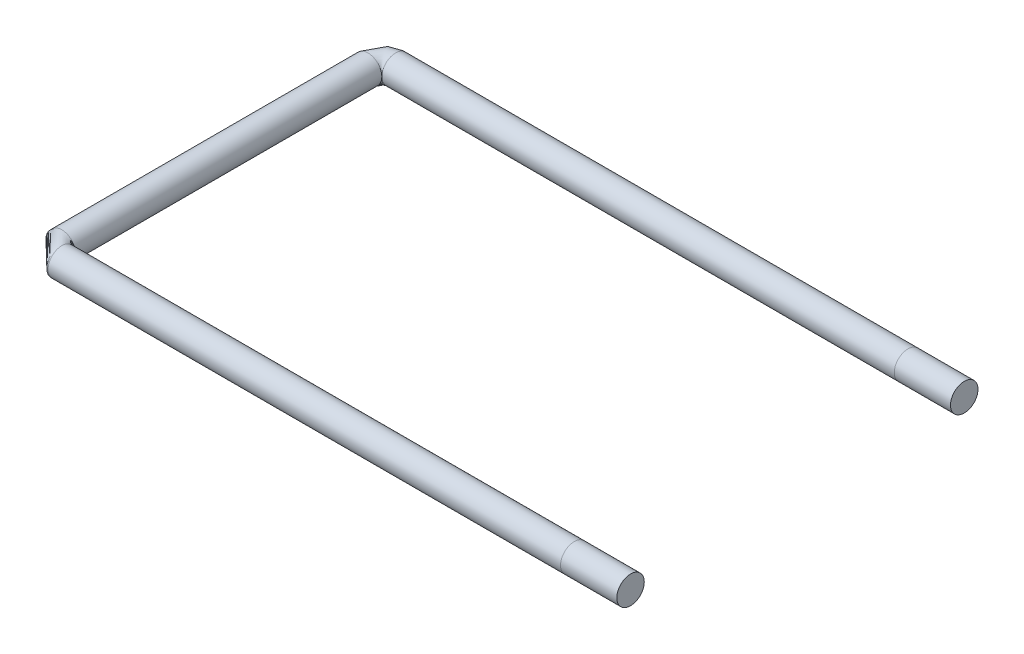
ISO-10303-21;
HEADER;
FILE_DESCRIPTION(('STEP AP214'),'2;1');
FILE_NAME('part.step','',(''),(''),'','','');
FILE_SCHEMA(('AUTOMOTIVE_DESIGN { 1 0 10303 214 1 1 1 1 }'));
ENDSEC;
DATA;
#1=APPLICATION_CONTEXT('core data for automotive mechanical design processes');
#2=APPLICATION_PROTOCOL_DEFINITION('international standard','automotive_design',2000,#1);
#3=PRODUCT_CONTEXT('',#1,'mechanical');
#4=PRODUCT('Part','Part','',(#3));
#5=PRODUCT_RELATED_PRODUCT_CATEGORY('part','',(#4));
#6=PRODUCT_DEFINITION_FORMATION('','',#4);
#7=PRODUCT_DEFINITION_CONTEXT('part definition',#1,'design');
#8=PRODUCT_DEFINITION('design','',#6,#7);
#9=PRODUCT_DEFINITION_SHAPE('','',#8);
#10=(LENGTH_UNIT() NAMED_UNIT(*) SI_UNIT(.MILLI.,.METRE.));
#11=(NAMED_UNIT(*) PLANE_ANGLE_UNIT() SI_UNIT($,.RADIAN.));
#12=(NAMED_UNIT(*) SI_UNIT($,.STERADIAN.) SOLID_ANGLE_UNIT());
#13=UNCERTAINTY_MEASURE_WITH_UNIT(LENGTH_MEASURE(1.E-05),#10,'distance_accuracy_value','');
#14=(GEOMETRIC_REPRESENTATION_CONTEXT(3) GLOBAL_UNCERTAINTY_ASSIGNED_CONTEXT((#13)) GLOBAL_UNIT_ASSIGNED_CONTEXT((#10,
#11,#12)) REPRESENTATION_CONTEXT('',''));
#15=CARTESIAN_POINT('',(0.,0.,0.));
#16=DIRECTION('',(0.,0.,1.));
#17=DIRECTION('',(1.,0.,0.));
#18=AXIS2_PLACEMENT_3D('',#15,#16,#17);
#19=CARTESIAN_POINT('',(11.,0.,0.));
#20=DIRECTION('',(0.,-1.,0.));
#21=DIRECTION('',(0.,0.,-1.));
#22=AXIS2_PLACEMENT_3D('',#19,#20,#21);
#23=TOROIDAL_SURFACE('',#22,11.,10.995);
#24=CARTESIAN_POINT('',(11.0000000000003,0.,11.));
#25=DIRECTION('',(1.,0.,0.));
#26=DIRECTION('',(0.,0.,-1.));
#27=AXIS2_PLACEMENT_3D('',#24,#25,#26);
#28=CIRCLE('',#27,11.);
#29=CARTESIAN_POINT('',(11.0000000000001,0.,0.));
#30=VERTEX_POINT('',#29);
#31=EDGE_CURVE('E11',#30,#30,#28,.T.);
#32=ORIENTED_EDGE('',*,*,#31,.F.);
#33=EDGE_LOOP('',(#32));
#34=FACE_BOUND('',#33,.T.);
#35=CARTESIAN_POINT('',(0.,0.,0.));
#36=DIRECTION('',(0.,0.,-1.));
#37=DIRECTION('',(1.,0.,0.));
#38=AXIS2_PLACEMENT_3D('',#35,#36,#37);
#39=CIRCLE('',#38,11.);
#40=CARTESIAN_POINT('',(10.9975,0.,0.));
#41=VERTEX_POINT('',#40);
#42=EDGE_CURVE('E47',#41,#41,#39,.T.);
#43=ORIENTED_EDGE('',*,*,#42,.F.);
#44=EDGE_LOOP('',(#43));
#45=FACE_BOUND('',#44,.T.);
#46=ADVANCED_FACE('F36',(#34,#45),#23,.T.);
#47=CARTESIAN_POINT('',(0.,0.,-122.5));
#48=DIRECTION('',(0.,0.,1.));
#49=DIRECTION('',(1.,0.,0.));
#50=AXIS2_PLACEMENT_3D('',#47,#48,#49);
#51=CYLINDRICAL_SURFACE('',#50,11.);
#52=ORIENTED_EDGE('',*,*,#42,.T.);
#53=EDGE_LOOP('',(#52));
#54=FACE_BOUND('',#53,.T.);
#55=CARTESIAN_POINT('',(10.995,0.,-245.));
#56=CARTESIAN_POINT('',(10.9950038162411,-0.179905448478485,-245.));
#57=CARTESIAN_POINT('',(10.9905845962911,-0.359810572232255,-245.));
#58=CARTESIAN_POINT('',(10.9729274856607,-0.719187586227661,-245.));
#59=CARTESIAN_POINT('',(10.9596895949803,-0.898659476469296,-245.));
#60=CARTESIAN_POINT('',(10.9244225445413,-1.25673743937773,-245.));
#61=CARTESIAN_POINT('',(10.9023933847825,-1.43534351204454,-245.));
#62=CARTESIAN_POINT('',(10.849598069343,-1.79125962122887,-245.));
#63=CARTESIAN_POINT('',(10.8188319136623,-1.9685696577464,-245.));
#64=CARTESIAN_POINT('',(10.7486364024048,-2.32146652338826,-245.));
#65=CARTESIAN_POINT('',(10.7092070468281,-2.49705335251259,-245.));
#66=CARTESIAN_POINT('',(10.62178021092,-2.84608080356018,-245.));
#67=CARTESIAN_POINT('',(10.5737827305886,-3.01952142548345,-245.));
#68=CARTESIAN_POINT('',(10.4693352521627,-3.36383862734217,-245.));
#69=CARTESIAN_POINT('',(10.4128852540681,-3.53471520727763,-245.));
#70=CARTESIAN_POINT('',(10.2916687393066,-3.87349266881729,-245.));
#71=CARTESIAN_POINT('',(10.2269022226397,-4.04139355042149,-245.));
#72=CARTESIAN_POINT('',(10.0892086972835,-4.37381512728684,-245.));
#73=CARTESIAN_POINT('',(10.0162816885943,-4.53833582254799,-245.));
#74=CARTESIAN_POINT('',(9.86244286719024,-4.86360068198392,-245.));
#75=CARTESIAN_POINT('',(9.78153105447544,-5.02434484615869,-245.));
#76=CARTESIAN_POINT('',(9.61191754854488,-5.34166939664499,-245.));
#77=CARTESIAN_POINT('',(9.52321585532911,-5.49824978295652,-245.));
#78=CARTESIAN_POINT('',(9.33823627857687,-5.80686956185243,-245.));
#79=CARTESIAN_POINT('',(9.2419583950404,-5.95890895443682,-245.));
#80=CARTESIAN_POINT('',(9.04205837949257,-6.25808046966423,-245.));
#81=CARTESIAN_POINT('',(8.93843624748122,-6.40521259230725,-245.));
#82=CARTESIAN_POINT('',(8.72409736977817,-6.69421511348135,-245.));
#83=CARTESIAN_POINT('',(8.61338062408647,-6.83608551201242,-245.));
#84=CARTESIAN_POINT('',(8.38511924536012,-7.11422280674614,-245.));
#85=CARTESIAN_POINT('',(8.26757461232548,-7.25048970294879,-245.));
#86=CARTESIAN_POINT('',(8.02594063423008,-7.51709171413715,-245.));
#87=CARTESIAN_POINT('',(7.90185128916932,-7.64742682912285,-245.));
#88=CARTESIAN_POINT('',(7.64742682912286,-7.90185128916932,-245.));
#89=CARTESIAN_POINT('',(7.51709171413715,-8.02594063423008,-245.));
#90=CARTESIAN_POINT('',(7.25048970294879,-8.26757461232546,-245.));
#91=CARTESIAN_POINT('',(7.11422280674614,-8.38511924536008,-245.));
#92=CARTESIAN_POINT('',(6.83608551201243,-8.6133806240865,-245.));
#93=CARTESIAN_POINT('',(6.69421511348136,-8.7240973697783,-245.));
#94=CARTESIAN_POINT('',(6.40521259230725,-8.93843624748108,-245.));
#95=CARTESIAN_POINT('',(6.25808046966421,-9.04205837949205,-245.));
#96=CARTESIAN_POINT('',(5.95890895443685,-9.24195839504092,-245.));
#97=CARTESIAN_POINT('',(5.80686956185252,-9.33823627857882,-245.));
#98=CARTESIAN_POINT('',(5.49824978295642,-9.52321585532716,-245.));
#99=CARTESIAN_POINT('',(5.34166939664464,-9.6119175485376,-245.));
#100=CARTESIAN_POINT('',(5.02434484615905,-9.78153105448273,-245.));
#101=CARTESIAN_POINT('',(4.86360068198525,-9.86244286721741,-245.));
#102=CARTESIAN_POINT('',(4.53833582254666,-10.0162816885671,-245.));
#103=CARTESIAN_POINT('',(4.37381512728186,-10.0892086971821,-245.));
#104=CARTESIAN_POINT('',(4.04139355042647,-10.2269022227411,-245.));
#105=CARTESIAN_POINT('',(3.87349266883588,-10.291668739685,-245.));
#106=CARTESIAN_POINT('',(3.53471520725904,-10.4128852536896,-245.));
#107=CARTESIAN_POINT('',(3.36383862727279,-10.4693352507503,-245.));
#108=CARTESIAN_POINT('',(3.01952142555284,-10.573782732001,-245.));
#109=CARTESIAN_POINT('',(2.84608080381914,-10.621780216191,-245.));
#110=CARTESIAN_POINT('',(2.49705335225364,-10.709207041557,-245.));
#111=CARTESIAN_POINT('',(2.32146652242185,-10.7486363827329,-245.));
#112=CARTESIAN_POINT('',(1.96856965871282,-10.8188319333341,-245.));
#113=CARTESIAN_POINT('',(1.79125962483559,-10.8495981427594,-245.));
#114=CARTESIAN_POINT('',(1.43534350843782,-10.9023933113661,-245.));
#115=CARTESIAN_POINT('',(1.25673742591729,-10.9244222705475,-245.));
#116=CARTESIAN_POINT('',(0.898659489929751,-10.9596898689741,-245.));
#117=CARTESIAN_POINT('',(0.719187636462753,-10.9729285082194,-245.));
#118=CARTESIAN_POINT('',(0.35981052199717,-10.9905835737323,-245.));
#119=CARTESIAN_POINT('',(0.179905260998586,-10.995,-245.));
#120=CARTESIAN_POINT('',(-0.179905260998582,-10.995,-245.));
#121=CARTESIAN_POINT('',(-0.359810521997166,-10.9905835737323,-245.));
#122=CARTESIAN_POINT('',(-0.719187636462748,-10.9729285082194,-245.));
#123=CARTESIAN_POINT('',(-0.898659489929747,-10.9596898689741,-245.));
#124=CARTESIAN_POINT('',(-1.25673742591728,-10.9244222705475,-245.));
#125=CARTESIAN_POINT('',(-1.43534350843781,-10.9023933113661,-245.));
#126=CARTESIAN_POINT('',(-1.79125962483558,-10.8495981427594,-245.));
#127=CARTESIAN_POINT('',(-1.96856965871281,-10.8188319333341,-245.));
#128=CARTESIAN_POINT('',(-2.32146652242183,-10.7486363827329,-245.));
#129=CARTESIAN_POINT('',(-2.49705335225363,-10.709207041557,-245.));
#130=CARTESIAN_POINT('',(-2.84608080381913,-10.621780216191,-245.));
#131=CARTESIAN_POINT('',(-3.01952142555284,-10.573782732001,-245.));
#132=CARTESIAN_POINT('',(-3.3638386272728,-10.4693352507503,-245.));
#133=CARTESIAN_POINT('',(-3.53471520725904,-10.4128852536896,-245.));
#134=CARTESIAN_POINT('',(-3.87349266883588,-10.291668739685,-245.));
#135=CARTESIAN_POINT('',(-4.04139355042647,-10.2269022227411,-245.));
#136=CARTESIAN_POINT('',(-4.37381512728186,-10.0892086971821,-245.));
#137=CARTESIAN_POINT('',(-4.53833582254665,-10.0162816885671,-245.));
#138=CARTESIAN_POINT('',(-4.86360068198525,-9.86244286721741,-245.));
#139=CARTESIAN_POINT('',(-5.02434484615905,-9.78153105448273,-245.));
#140=CARTESIAN_POINT('',(-5.34166939664463,-9.6119175485376,-245.));
#141=CARTESIAN_POINT('',(-5.49824978295642,-9.52321585532716,-245.));
#142=CARTESIAN_POINT('',(-5.80686956185252,-9.33823627857882,-245.));
#143=CARTESIAN_POINT('',(-5.95890895443684,-9.24195839504092,-245.));
#144=CARTESIAN_POINT('',(-6.2580804696642,-9.04205837949205,-245.));
#145=CARTESIAN_POINT('',(-6.40521259230725,-8.93843624748108,-245.));
#146=CARTESIAN_POINT('',(-6.69421511348135,-8.72409736977831,-245.));
#147=CARTESIAN_POINT('',(-6.83608551201242,-8.61338062408651,-245.));
#148=CARTESIAN_POINT('',(-7.11422280674613,-8.38511924536009,-245.));
#149=CARTESIAN_POINT('',(-7.25048970294878,-8.26757461232547,-245.));
#150=CARTESIAN_POINT('',(-7.51709171413714,-8.02594063423009,-245.));
#151=CARTESIAN_POINT('',(-7.64742682912285,-7.90185128916933,-245.));
#152=CARTESIAN_POINT('',(-7.90185128916932,-7.64742682912286,-245.));
#153=CARTESIAN_POINT('',(-8.02594063423008,-7.51709171413715,-245.));
#154=CARTESIAN_POINT('',(-8.26757461232547,-7.25048970294878,-245.));
#155=CARTESIAN_POINT('',(-8.38511924536009,-7.11422280674614,-245.));
#156=CARTESIAN_POINT('',(-8.6133806240865,-6.83608551201242,-245.));
#157=CARTESIAN_POINT('',(-8.72409736977831,-6.69421511348136,-245.));
#158=CARTESIAN_POINT('',(-8.93843624748108,-6.40521259230725,-245.));
#159=CARTESIAN_POINT('',(-9.04205837949205,-6.25808046966421,-245.));
#160=CARTESIAN_POINT('',(-9.24195839504092,-5.95890895443685,-245.));
#161=CARTESIAN_POINT('',(-9.33823627857882,-5.80686956185253,-245.));
#162=CARTESIAN_POINT('',(-9.52321585532716,-5.49824978295642,-245.));
#163=CARTESIAN_POINT('',(-9.6119175485376,-5.34166939664464,-245.));
#164=CARTESIAN_POINT('',(-9.78153105448272,-5.02434484615905,-245.));
#165=CARTESIAN_POINT('',(-9.86244286721741,-4.86360068198525,-245.));
#166=CARTESIAN_POINT('',(-10.0162816885671,-4.53833582254666,-245.));
#167=CARTESIAN_POINT('',(-10.0892086971821,-4.37381512728186,-245.));
#168=CARTESIAN_POINT('',(-10.2269022227411,-4.04139355042648,-245.));
#169=CARTESIAN_POINT('',(-10.291668739685,-3.87349266883589,-245.));
#170=CARTESIAN_POINT('',(-10.4128852536896,-3.53471520725905,-245.));
#171=CARTESIAN_POINT('',(-10.4693352507503,-3.3638386272728,-245.));
#172=CARTESIAN_POINT('',(-10.573782732001,-3.01952142555284,-245.));
#173=CARTESIAN_POINT('',(-10.621780216191,-2.84608080381913,-245.));
#174=CARTESIAN_POINT('',(-10.709207041557,-2.49705335225363,-245.));
#175=CARTESIAN_POINT('',(-10.7486363827329,-2.32146652242184,-245.));
#176=CARTESIAN_POINT('',(-10.8188319333341,-1.96856965871281,-245.));
#177=CARTESIAN_POINT('',(-10.8495981427594,-1.79125962483558,-245.));
#178=CARTESIAN_POINT('',(-10.9023933113661,-1.43534350843782,-245.));
#179=CARTESIAN_POINT('',(-10.9244222705475,-1.25673742591728,-245.));
#180=CARTESIAN_POINT('',(-10.9596898689741,-0.898659489929752,-245.));
#181=CARTESIAN_POINT('',(-10.9729285082194,-0.719187636462753,-245.));
#182=CARTESIAN_POINT('',(-10.9905835737323,-0.359810521997171,-245.));
#183=CARTESIAN_POINT('',(-10.995,-0.179905260998587,-245.));
#184=CARTESIAN_POINT('',(-10.995,0.179905260998581,-245.));
#185=CARTESIAN_POINT('',(-10.9905835737323,0.359810521997165,-245.));
#186=CARTESIAN_POINT('',(-10.9729285082194,0.719187636462748,-245.));
#187=CARTESIAN_POINT('',(-10.9596898689741,0.898659489929746,-245.));
#188=CARTESIAN_POINT('',(-10.9244222705475,1.25673742591728,-245.));
#189=CARTESIAN_POINT('',(-10.9023933113661,1.43534350843781,-245.));
#190=CARTESIAN_POINT('',(-10.8495981427594,1.79125962483558,-245.));
#191=CARTESIAN_POINT('',(-10.8188319333341,1.96856965871281,-245.));
#192=CARTESIAN_POINT('',(-10.7486363827329,2.32146652242183,-245.));
#193=CARTESIAN_POINT('',(-10.709207041557,2.49705335225363,-245.));
#194=CARTESIAN_POINT('',(-10.621780216191,2.84608080381913,-245.));
#195=CARTESIAN_POINT('',(-10.573782732001,3.01952142555284,-245.));
#196=CARTESIAN_POINT('',(-10.4693352507503,3.36383862727279,-245.));
#197=CARTESIAN_POINT('',(-10.4128852536896,3.53471520725904,-245.));
#198=CARTESIAN_POINT('',(-10.291668739685,3.87349266883588,-245.));
#199=CARTESIAN_POINT('',(-10.2269022227411,4.04139355042647,-245.));
#200=CARTESIAN_POINT('',(-10.0892086971821,4.37381512728186,-245.));
#201=CARTESIAN_POINT('',(-10.0162816885671,4.53833582254665,-245.));
#202=CARTESIAN_POINT('',(-9.86244286721741,4.86360068198525,-245.));
#203=CARTESIAN_POINT('',(-9.78153105448273,5.02434484615905,-245.));
#204=CARTESIAN_POINT('',(-9.6119175485376,5.34166939664463,-245.));
#205=CARTESIAN_POINT('',(-9.52321585532716,5.49824978295642,-245.));
#206=CARTESIAN_POINT('',(-9.33823627857882,5.80686956185252,-245.));
#207=CARTESIAN_POINT('',(-9.24195839504092,5.95890895443684,-245.));
#208=CARTESIAN_POINT('',(-9.04205837949205,6.2580804696642,-245.));
#209=CARTESIAN_POINT('',(-8.93843624748108,6.40521259230725,-245.));
#210=CARTESIAN_POINT('',(-8.72409736977831,6.69421511348135,-245.));
#211=CARTESIAN_POINT('',(-8.6133806240865,6.83608551201242,-245.));
#212=CARTESIAN_POINT('',(-8.38511924536009,7.11422280674613,-245.));
#213=CARTESIAN_POINT('',(-8.26757461232547,7.25048970294878,-245.));
#214=CARTESIAN_POINT('',(-8.02594063423009,7.51709171413714,-245.));
#215=CARTESIAN_POINT('',(-7.90185128916933,7.64742682912286,-245.));
#216=CARTESIAN_POINT('',(-7.64742682912285,7.90185128916933,-245.));
#217=CARTESIAN_POINT('',(-7.51709171413714,8.02594063423009,-245.));
#218=CARTESIAN_POINT('',(-7.25048970294879,8.26757461232547,-245.));
#219=CARTESIAN_POINT('',(-7.11422280674614,8.38511924536008,-245.));
#220=CARTESIAN_POINT('',(-6.83608551201242,8.6133806240865,-245.));
#221=CARTESIAN_POINT('',(-6.69421511348136,8.7240973697783,-245.));
#222=CARTESIAN_POINT('',(-6.40521259230725,8.93843624748108,-245.));
#223=CARTESIAN_POINT('',(-6.25808046966421,9.04205837949205,-245.));
#224=CARTESIAN_POINT('',(-5.95890895443684,9.24195839504092,-245.));
#225=CARTESIAN_POINT('',(-5.80686956185253,9.33823627857882,-245.));
#226=CARTESIAN_POINT('',(-5.49824978295642,9.52321585532716,-245.));
#227=CARTESIAN_POINT('',(-5.34166939664464,9.6119175485376,-245.));
#228=CARTESIAN_POINT('',(-5.02434484615905,9.78153105448272,-245.));
#229=CARTESIAN_POINT('',(-4.86360068198526,9.86244286721741,-245.));
#230=CARTESIAN_POINT('',(-4.53833582254666,10.0162816885671,-245.));
#231=CARTESIAN_POINT('',(-4.37381512728186,10.0892086971821,-245.));
#232=CARTESIAN_POINT('',(-4.04139355042648,10.2269022227411,-245.));
#233=CARTESIAN_POINT('',(-3.87349266883589,10.291668739685,-245.));
#234=CARTESIAN_POINT('',(-3.53471520725905,10.4128852536896,-245.));
#235=CARTESIAN_POINT('',(-3.3638386272728,10.4693352507503,-245.));
#236=CARTESIAN_POINT('',(-3.01952142555284,10.573782732001,-245.));
#237=CARTESIAN_POINT('',(-2.84608080381914,10.621780216191,-245.));
#238=CARTESIAN_POINT('',(-2.49705335225363,10.709207041557,-245.));
#239=CARTESIAN_POINT('',(-2.32146652242184,10.7486363827329,-245.));
#240=CARTESIAN_POINT('',(-1.96856965871281,10.8188319333341,-245.));
#241=CARTESIAN_POINT('',(-1.79125962483558,10.8495981427594,-245.));
#242=CARTESIAN_POINT('',(-1.43534350843782,10.9023933113661,-245.));
#243=CARTESIAN_POINT('',(-1.25673742591728,10.9244222705475,-245.));
#244=CARTESIAN_POINT('',(-0.898659489929752,10.9596898689741,-245.));
#245=CARTESIAN_POINT('',(-0.719187636462753,10.9729285082194,-245.));
#246=CARTESIAN_POINT('',(-0.359810521997171,10.9905835737323,-245.));
#247=CARTESIAN_POINT('',(-0.179905260998587,10.995,-245.));
#248=CARTESIAN_POINT('',(0.179905260998581,10.995,-245.));
#249=CARTESIAN_POINT('',(0.359810521997165,10.9905835737323,-245.));
#250=CARTESIAN_POINT('',(0.719187636462748,10.9729285082194,-245.));
#251=CARTESIAN_POINT('',(0.898659489929746,10.9596898689741,-245.));
#252=CARTESIAN_POINT('',(1.25673742591728,10.9244222705475,-245.));
#253=CARTESIAN_POINT('',(1.43534350843781,10.9023933113661,-245.));
#254=CARTESIAN_POINT('',(1.79125962483558,10.8495981427594,-245.));
#255=CARTESIAN_POINT('',(1.96856965871281,10.8188319333341,-245.));
#256=CARTESIAN_POINT('',(2.32146652242183,10.7486363827329,-245.));
#257=CARTESIAN_POINT('',(2.49705335225363,10.709207041557,-245.));
#258=CARTESIAN_POINT('',(2.84608080381913,10.621780216191,-245.));
#259=CARTESIAN_POINT('',(3.01952142555284,10.573782732001,-245.));
#260=CARTESIAN_POINT('',(3.36383862727279,10.4693352507503,-245.));
#261=CARTESIAN_POINT('',(3.53471520725904,10.4128852536896,-245.));
#262=CARTESIAN_POINT('',(3.87349266883588,10.291668739685,-245.));
#263=CARTESIAN_POINT('',(4.04139355042647,10.2269022227411,-245.));
#264=CARTESIAN_POINT('',(4.37381512728186,10.0892086971821,-245.));
#265=CARTESIAN_POINT('',(4.53833582254665,10.0162816885671,-245.));
#266=CARTESIAN_POINT('',(4.86360068198525,9.86244286721741,-245.));
#267=CARTESIAN_POINT('',(5.02434484615905,9.78153105448273,-245.));
#268=CARTESIAN_POINT('',(5.34166939664463,9.6119175485376,-245.));
#269=CARTESIAN_POINT('',(5.49824978295642,9.52321585532716,-245.));
#270=CARTESIAN_POINT('',(5.80686956185252,9.33823627857882,-245.));
#271=CARTESIAN_POINT('',(5.95890895443684,9.24195839504092,-245.));
#272=CARTESIAN_POINT('',(6.2580804696642,9.04205837949205,-245.));
#273=CARTESIAN_POINT('',(6.40521259230724,8.93843624748108,-245.));
#274=CARTESIAN_POINT('',(6.69421511348135,8.72409736977831,-245.));
#275=CARTESIAN_POINT('',(6.83608551201242,8.61338062408651,-245.));
#276=CARTESIAN_POINT('',(7.11422280674613,8.38511924536009,-245.));
#277=CARTESIAN_POINT('',(7.25048970294878,8.26757461232547,-245.));
#278=CARTESIAN_POINT('',(7.51709171413714,8.02594063423009,-245.));
#279=CARTESIAN_POINT('',(7.64742682912285,7.90185128916933,-245.));
#280=CARTESIAN_POINT('',(7.90185128916932,7.64742682912286,-245.));
#281=CARTESIAN_POINT('',(8.02594063423007,7.51709171413715,-245.));
#282=CARTESIAN_POINT('',(8.26757461232548,7.25048970294879,-245.));
#283=CARTESIAN_POINT('',(8.38511924536012,7.11422280674614,-245.));
#284=CARTESIAN_POINT('',(8.61338062408647,6.83608551201242,-245.));
#285=CARTESIAN_POINT('',(8.72409736977816,6.69421511348135,-245.));
#286=CARTESIAN_POINT('',(8.93843624748122,6.40521259230726,-245.));
#287=CARTESIAN_POINT('',(9.04205837949257,6.25808046966423,-245.));
#288=CARTESIAN_POINT('',(9.2419583950404,5.95890895443682,-245.));
#289=CARTESIAN_POINT('',(9.33823627857687,5.80686956185243,-245.));
#290=CARTESIAN_POINT('',(9.52321585532911,5.49824978295652,-245.));
#291=CARTESIAN_POINT('',(9.61191754854488,5.341669396645,-245.));
#292=CARTESIAN_POINT('',(9.78153105447544,5.0243448461587,-245.));
#293=CARTESIAN_POINT('',(9.86244286719024,4.86360068198392,-245.));
#294=CARTESIAN_POINT('',(10.0162816885943,4.53833582254799,-245.));
#295=CARTESIAN_POINT('',(10.0892086972835,4.37381512728684,-245.));
#296=CARTESIAN_POINT('',(10.2269022226397,4.0413935504215,-245.));
#297=CARTESIAN_POINT('',(10.2916687393066,3.8734926688173,-245.));
#298=CARTESIAN_POINT('',(10.4128852540681,3.53471520727764,-245.));
#299=CARTESIAN_POINT('',(10.4693352521627,3.36383862734219,-245.));
#300=CARTESIAN_POINT('',(10.5737827305886,3.01952142548346,-245.));
#301=CARTESIAN_POINT('',(10.62178021092,2.84608080356018,-245.));
#302=CARTESIAN_POINT('',(10.7092070468281,2.49705335251258,-245.));
#303=CARTESIAN_POINT('',(10.7486364024048,2.32146652338826,-245.));
#304=CARTESIAN_POINT('',(10.8188319136623,1.9685696577464,-245.));
#305=CARTESIAN_POINT('',(10.849598069343,1.79125962122887,-245.));
#306=CARTESIAN_POINT('',(10.9023933847825,1.43534351204454,-245.));
#307=CARTESIAN_POINT('',(10.9244225445413,1.25673743937774,-245.));
#308=CARTESIAN_POINT('',(10.9596895949803,0.898659476469302,-245.));
#309=CARTESIAN_POINT('',(10.9729274856607,0.719187586227666,-245.));
#310=CARTESIAN_POINT('',(10.9905845962911,0.35981057223226,-245.));
#311=CARTESIAN_POINT('',(10.9950038162411,0.17990544847849,-245.));
#312=CARTESIAN_POINT('',(10.995,0.,-245.));
#313=B_SPLINE_CURVE_WITH_KNOTS('',3,(#55,#56,#57,#58,#59,#60,#61,#62,#63,#64,#65,#66,#67,#68,
#69,#70,#71,#72,#73,#74,#75,#76,#77,#78,#79,#80,#81,#82,#83,#84,#85,#86,#87,#88,#89,#90,#91,#92,
#93,#94,#95,#96,#97,#98,#99,#100,#101,#102,#103,#104,#105,#106,#107,#108,#109,#110,#111,#112,
#113,#114,#115,#116,#117,#118,#119,#120,#121,#122,#123,#124,#125,#126,#127,#128,#129,#130,#131,
#132,#133,#134,#135,#136,#137,#138,#139,#140,#141,#142,#143,#144,#145,#146,#147,#148,#149,#150,
#151,#152,#153,#154,#155,#156,#157,#158,#159,#160,#161,#162,#163,#164,#165,#166,#167,#168,#169,
#170,#171,#172,#173,#174,#175,#176,#177,#178,#179,#180,#181,#182,#183,#184,#185,#186,#187,#188,
#189,#190,#191,#192,#193,#194,#195,#196,#197,#198,#199,#200,#201,#202,#203,#204,#205,#206,#207,
#208,#209,#210,#211,#212,#213,#214,#215,#216,#217,#218,#219,#220,#221,#222,#223,#224,#225,#226,
#227,#228,#229,#230,#231,#232,#233,#234,#235,#236,#237,#238,#239,#240,#241,#242,#243,#244,#245,
#246,#247,#248,#249,#250,#251,#252,#253,#254,#255,#256,#257,#258,#259,#260,#261,#262,#263,#264,
#265,#266,#267,#268,#269,#270,#271,#272,#273,#274,#275,#276,#277,#278,#279,#280,#281,#282,#283,
#284,#285,#286,#287,#288,#289,#290,#291,#292,#293,#294,#295,#296,#297,#298,#299,#300,#301,#302,
#303,#304,#305,#306,#307,#308,#309,#310,#311,#312),.UNSPECIFIED.,.F.,.F.,(4,2,2,2,2,2,2,2,2,2,2,
2,2,2,2,2,2,2,2,2,2,2,2,2,2,2,2,2,2,2,2,2,2,2,2,2,2,2,2,2,2,2,2,2,2,2,2,2,2,2,2,2,2,2,2,2,2,2,2,
2,2,2,2,2,2,2,2,2,2,2,2,2,2,2,2,2,2,2,2,2,2,2,2,2,2,2,2,2,2,2,2,2,2,2,2,2,2,2,2,2,2,2,2,2,2,2,2,
2,2,2,2,2,2,2,2,2,2,2,2,2,2,2,2,2,2,2,2,2,4),(0.,0.539661615218839,1.07932323043768,
1.61898484565653,2.15864646087537,2.69830807609421,3.23796969131305,3.77763130653189,
4.31729292175074,4.85695453696957,5.39661615218841,5.93627776740725,6.47593938262609,
7.01560099784493,7.55526261306378,8.09492422828262,8.63458584350146,9.1742474587203,
9.71390907393914,10.253570689158,10.7932323043768,11.3328939195957,11.8725555348145,
12.4122171500333,12.9518787652522,13.491540380471,14.0312019956899,14.5708636109087,
15.1105252261276,15.6501868413464,16.1898484565652,16.7295100717841,17.2691716870029,
17.8088333022218,18.3484949174406,18.8881565326594,19.4278181478783,19.9674797630971,
20.507141378316,21.0468029935348,21.5864646087536,22.1261262239725,22.6657878391913,
23.2054494544102,23.745111069629,24.2847726848478,24.8244343000667,25.3640959152855,
25.9037575305044,26.4434191457232,26.9830807609421,27.5227423761609,28.0624039913797,
28.6020656065986,29.1417272218174,29.6813888370363,30.2210504522551,30.7607120674739,
31.3003736826928,31.8400352979116,32.3796969131305,32.9193585283493,33.4590201435681,
33.998681758787,34.5383433740058,35.0780049892247,35.6176666044435,36.1573282196623,
36.6969898348812,37.2366514501,37.7763130653189,38.3159746805377,38.8556362957565,
39.3952979109754,39.9349595261942,40.4746211414131,41.0142827566319,41.5539443718507,
42.0936059870696,42.6332676022884,43.1729292175073,43.7125908327261,44.252252447945,
44.7919140631638,45.3315756783826,45.8712372936015,46.4108989088203,46.9505605240391,
47.490222139258,48.0298837544768,48.5695453696957,49.1092069849145,49.6488686001334,
50.1885302153522,50.728191830571,51.2678534457899,51.8075150610087,52.3471766762275,
52.8868382914464,53.4264999066652,53.9661615218841,54.5058231371029,55.0454847523218,
55.5851463675406,56.1248079827594,56.6644695979783,57.2041312131971,57.7437928284159,
58.2834544436348,58.8231160588536,59.3627776740725,59.9024392892913,60.4421009045101,
60.981762519729,61.5214241349478,62.0610857501667,62.6007473653855,63.1404089806044,
63.6800705958232,64.219732211042,64.7593938262609,65.2990554414797,65.8387170566986,
66.3783786719174,66.9180402871363,67.4577019023551,67.997363517574,68.5370251327928,
69.0766867480117),.UNSPECIFIED.);
#314=CARTESIAN_POINT('',(10.9975,0.,-245.));
#315=VERTEX_POINT('',#314);
#316=EDGE_CURVE('E52',#315,#315,#313,.T.);
#317=ORIENTED_EDGE('',*,*,#316,.F.);
#318=EDGE_LOOP('',(#317));
#319=FACE_BOUND('',#318,.T.);
#320=ADVANCED_FACE('F58',(#54,#319),#51,.T.);
#321=CARTESIAN_POINT('',(11.,0.,-245.));
#322=DIRECTION('',(0.,-1.,0.));
#323=DIRECTION('',(0.,0.,1.));
#324=AXIS2_PLACEMENT_3D('',#321,#322,#323);
#325=TOROIDAL_SURFACE('',#324,11.,10.995);
#326=CARTESIAN_POINT('',(10.9999999999993,0.,-256.));
#327=DIRECTION('',(1.,0.,0.));
#328=DIRECTION('',(0.,0.,1.));
#329=AXIS2_PLACEMENT_3D('',#326,#327,#328);
#330=CIRCLE('',#329,11.);
#331=CARTESIAN_POINT('',(10.9999999999993,0.,-245.));
#332=VERTEX_POINT('',#331);
#333=EDGE_CURVE('E106',#332,#332,#330,.T.);
#334=ORIENTED_EDGE('',*,*,#333,.F.);
#335=EDGE_LOOP('',(#334));
#336=FACE_BOUND('',#335,.T.);
#337=ORIENTED_EDGE('',*,*,#316,.T.);
#338=EDGE_LOOP('',(#337));
#339=FACE_BOUND('',#338,.T.);
#340=ADVANCED_FACE('F77',(#336,#339),#325,.T.);
#341=CARTESIAN_POINT('',(421.,0.,10.9999999999986));
#342=DIRECTION('',(-1.,0.,0.));
#343=DIRECTION('',(0.,0.,1.));
#344=AXIS2_PLACEMENT_3D('',#341,#342,#343);
#345=CYLINDRICAL_SURFACE('',#344,11.);
#346=CARTESIAN_POINT('',(421.,0.,10.9999999999986));
#347=DIRECTION('',(1.,0.,0.));
#348=DIRECTION('',(0.,0.,-1.));
#349=AXIS2_PLACEMENT_3D('',#346,#347,#348);
#350=CIRCLE('',#349,10.995);
#351=CARTESIAN_POINT('',(421.,0.,0.00499999999856865));
#352=VERTEX_POINT('',#351);
#353=EDGE_CURVE('E119',#352,#352,#350,.T.);
#354=ORIENTED_EDGE('',*,*,#353,.F.);
#355=EDGE_LOOP('',(#354));
#356=FACE_BOUND('',#355,.T.);
#357=ORIENTED_EDGE('',*,*,#31,.T.);
#358=EDGE_LOOP('',(#357));
#359=FACE_BOUND('',#358,.T.);
#360=ADVANCED_FACE('F123',(#356,#359),#345,.T.);
#361=CARTESIAN_POINT('',(420.999999999999,0.,-256.000000000001));
#362=DIRECTION('',(-1.,0.,0.));
#363=DIRECTION('',(0.,0.,1.));
#364=AXIS2_PLACEMENT_3D('',#361,#362,#363);
#365=CYLINDRICAL_SURFACE('',#364,11.);
#366=CARTESIAN_POINT('',(420.999999999999,0.,-256.000000000001));
#367=DIRECTION('',(1.,0.,0.));
#368=DIRECTION('',(0.,0.,-1.));
#369=AXIS2_PLACEMENT_3D('',#366,#367,#368);
#370=CIRCLE('',#369,10.995);
#371=CARTESIAN_POINT('',(420.999999999999,0.,-266.995000000001));
#372=VERTEX_POINT('',#371);
#373=EDGE_CURVE('E195',#372,#372,#370,.T.);
#374=ORIENTED_EDGE('',*,*,#373,.F.);
#375=EDGE_LOOP('',(#374));
#376=FACE_BOUND('',#375,.T.);
#377=ORIENTED_EDGE('',*,*,#333,.T.);
#378=EDGE_LOOP('',(#377));
#379=FACE_BOUND('',#378,.T.);
#380=ADVANCED_FACE('F131',(#376,#379),#365,.T.);
#381=CARTESIAN_POINT('',(466.,0.,10.9999999999984));
#382=DIRECTION('',(-1.,0.,0.));
#383=DIRECTION('',(0.,0.,1.));
#384=AXIS2_PLACEMENT_3D('',#381,#382,#383);
#385=CYLINDRICAL_SURFACE('',#384,10.995);
#386=CARTESIAN_POINT('',(466.,0.,10.9999999999984));
#387=DIRECTION('',(1.,0.,0.));
#388=DIRECTION('',(0.,0.,-1.));
#389=AXIS2_PLACEMENT_3D('',#386,#387,#388);
#390=CIRCLE('',#389,10.995);
#391=CARTESIAN_POINT('',(466.,0.,0.00499999999841079));
#392=VERTEX_POINT('',#391);
#393=EDGE_CURVE('E186',#392,#392,#390,.T.);
#394=ORIENTED_EDGE('',*,*,#393,.F.);
#395=EDGE_LOOP('',(#394));
#396=FACE_BOUND('',#395,.T.);
#397=ORIENTED_EDGE('',*,*,#353,.T.);
#398=EDGE_LOOP('',(#397));
#399=FACE_BOUND('',#398,.T.);
#400=ADVANCED_FACE('F160',(#396,#399),#385,.T.);
#401=CARTESIAN_POINT('',(466.,0.,10.9999999999984));
#402=DIRECTION('',(1.,0.,0.));
#403=DIRECTION('',(0.,0.,-1.));
#404=AXIS2_PLACEMENT_3D('',#401,#402,#403);
#405=PLANE('',#404);
#406=ORIENTED_EDGE('',*,*,#393,.T.);
#407=EDGE_LOOP('',(#406));
#408=FACE_BOUND('',#407,.T.);
#409=ADVANCED_FACE('F169',(#408),#405,.T.);
#410=CARTESIAN_POINT('',(465.999999999999,0.,-256.000000000002));
#411=DIRECTION('',(-1.,0.,0.));
#412=DIRECTION('',(0.,0.,1.));
#413=AXIS2_PLACEMENT_3D('',#410,#411,#412);
#414=CYLINDRICAL_SURFACE('',#413,10.995);
#415=CARTESIAN_POINT('',(465.999999999999,0.,-256.000000000002));
#416=DIRECTION('',(1.,0.,0.));
#417=DIRECTION('',(0.,0.,-1.));
#418=AXIS2_PLACEMENT_3D('',#415,#416,#417);
#419=CIRCLE('',#418,10.995);
#420=CARTESIAN_POINT('',(465.999999999999,0.,-266.995000000002));
#421=VERTEX_POINT('',#420);
#422=EDGE_CURVE('E193',#421,#421,#419,.T.);
#423=ORIENTED_EDGE('',*,*,#422,.F.);
#424=EDGE_LOOP('',(#423));
#425=FACE_BOUND('',#424,.T.);
#426=ORIENTED_EDGE('',*,*,#373,.T.);
#427=EDGE_LOOP('',(#426));
#428=FACE_BOUND('',#427,.T.);
#429=ADVANCED_FACE('F173',(#425,#428),#414,.T.);
#430=CARTESIAN_POINT('',(465.999999999999,0.,-256.000000000002));
#431=DIRECTION('',(1.,0.,0.));
#432=DIRECTION('',(0.,0.,-1.));
#433=AXIS2_PLACEMENT_3D('',#430,#431,#432);
#434=PLANE('',#433);
#435=ORIENTED_EDGE('',*,*,#422,.T.);
#436=EDGE_LOOP('',(#435));
#437=FACE_BOUND('',#436,.T.);
#438=ADVANCED_FACE('F178',(#437),#434,.T.);
#439=CLOSED_SHELL('',(#46,#320,#340,#360,#380,#400,#409,#429,#438));
#440=MANIFOLD_SOLID_BREP('B2',#439);
#441=ADVANCED_BREP_SHAPE_REPRESENTATION('',(#18,#440),#14);
#442=SHAPE_DEFINITION_REPRESENTATION(#9,#441);
ENDSEC;
END-ISO-10303-21;
